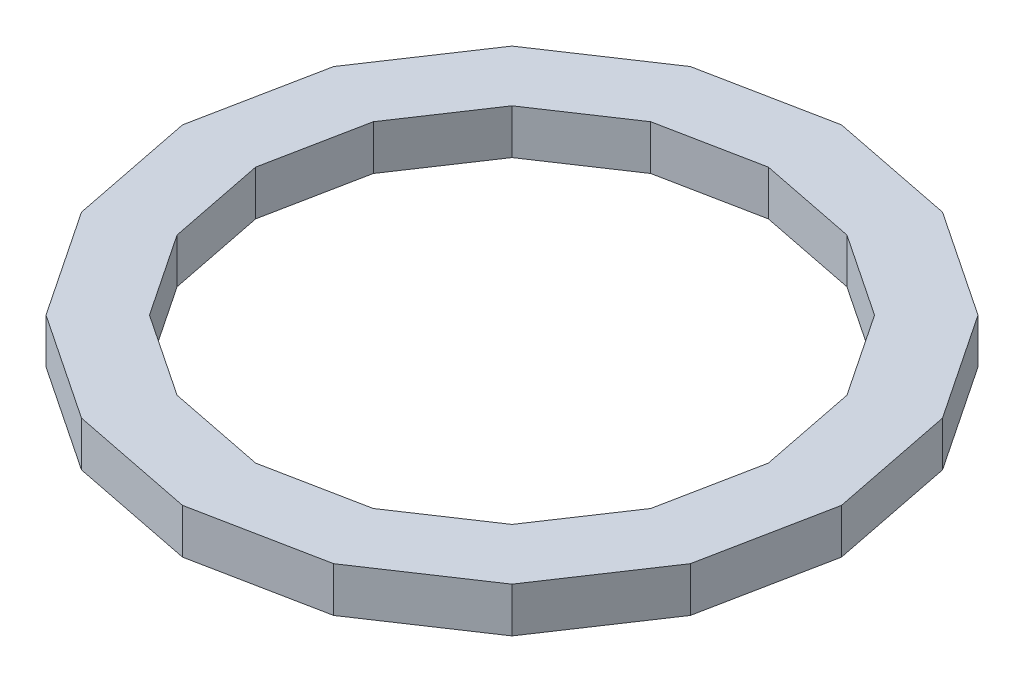
ISO-10303-21;
HEADER;
FILE_DESCRIPTION(('STEP AP214'),'2;1');
FILE_NAME('part.step','',(''),(''),'','','');
FILE_SCHEMA(('AUTOMOTIVE_DESIGN { 1 0 10303 214 1 1 1 1 }'));
ENDSEC;
DATA;
#1=APPLICATION_CONTEXT('core data for automotive mechanical design processes');
#2=APPLICATION_PROTOCOL_DEFINITION('international standard','automotive_design',2000,#1);
#3=PRODUCT_CONTEXT('',#1,'mechanical');
#4=PRODUCT('Part','Part','',(#3));
#5=PRODUCT_RELATED_PRODUCT_CATEGORY('part','',(#4));
#6=PRODUCT_DEFINITION_FORMATION('','',#4);
#7=PRODUCT_DEFINITION_CONTEXT('part definition',#1,'design');
#8=PRODUCT_DEFINITION('design','',#6,#7);
#9=PRODUCT_DEFINITION_SHAPE('','',#8);
#10=(LENGTH_UNIT() NAMED_UNIT(*) SI_UNIT(.MILLI.,.METRE.));
#11=(NAMED_UNIT(*) PLANE_ANGLE_UNIT() SI_UNIT($,.RADIAN.));
#12=(NAMED_UNIT(*) SI_UNIT($,.STERADIAN.) SOLID_ANGLE_UNIT());
#13=UNCERTAINTY_MEASURE_WITH_UNIT(LENGTH_MEASURE(1.E-05),#10,'distance_accuracy_value','');
#14=(GEOMETRIC_REPRESENTATION_CONTEXT(3) GLOBAL_UNCERTAINTY_ASSIGNED_CONTEXT((#13)) GLOBAL_UNIT_ASSIGNED_CONTEXT((#10,
#11,#12)) REPRESENTATION_CONTEXT('',''));
#15=CARTESIAN_POINT('',(0.,0.,0.));
#16=DIRECTION('',(0.,0.,1.));
#17=DIRECTION('',(1.,0.,0.));
#18=AXIS2_PLACEMENT_3D('',#15,#16,#17);
#19=CARTESIAN_POINT('',(0.,19.05,0.));
#20=DIRECTION('',(0.,1.,0.));
#21=DIRECTION('',(0.,0.,1.));
#22=AXIS2_PLACEMENT_3D('',#19,#20,#21);
#23=PLANE('',#22);
#24=DIRECTION('',(0.195090322016117,0.,-0.980785280403233));
#25=VECTOR('',#24,1.);
#26=CARTESIAN_POINT('',(129.306930115863,19.05,53.5606841628188));
#27=LINE('',#26,#25);
#28=CARTESIAN_POINT('',(129.306930115863,19.05,53.5606841628188));
#29=VERTEX_POINT('',#28);
#30=CARTESIAN_POINT('',(139.960812601163,19.05,-1.5126838018905E-12));
#31=VERTEX_POINT('',#30);
#32=EDGE_CURVE('E380',#29,#31,#27,.T.);
#33=ORIENTED_EDGE('',*,*,#32,.T.);
#34=DIRECTION('',(-0.19509032201614,0.,-0.980785280403228));
#35=VECTOR('',#34,1.);
#36=CARTESIAN_POINT('',(139.960812601163,19.05,-1.5126838018905E-12));
#37=LINE('',#36,#35);
#38=CARTESIAN_POINT('',(129.306930115862,19.05,-53.5606841628218));
#39=VERTEX_POINT('',#38);
#40=EDGE_CURVE('E384',#31,#39,#37,.T.);
#41=ORIENTED_EDGE('',*,*,#40,.T.);
#42=DIRECTION('',(-0.555570233019612,0.,-0.831469612302539));
#43=VECTOR('',#42,1.);
#44=CARTESIAN_POINT('',(129.306930115862,19.05,-53.5606841628218));
#45=LINE('',#44,#43);
#46=CARTESIAN_POINT('',(98.9672396906611,19.05,-98.9672396906633));
#47=VERTEX_POINT('',#46);
#48=EDGE_CURVE('E388',#39,#47,#45,.T.);
#49=ORIENTED_EDGE('',*,*,#48,.T.);
#50=DIRECTION('',(-0.831469612302552,0.,-0.555570233019593));
#51=VECTOR('',#50,1.);
#52=CARTESIAN_POINT('',(98.9672396906611,19.05,-98.9672396906633));
#53=LINE('',#52,#51);
#54=CARTESIAN_POINT('',(53.5606841628189,19.05,-129.306930115863));
#55=VERTEX_POINT('',#54);
#56=EDGE_CURVE('E391',#47,#55,#53,.T.);
#57=ORIENTED_EDGE('',*,*,#56,.T.);
#58=DIRECTION('',(-0.980785280403233,0.,-0.195090322016117));
#59=VECTOR('',#58,1.);
#60=CARTESIAN_POINT('',(53.5606841628189,19.05,-129.306930115863));
#61=LINE('',#60,#59);
#62=CARTESIAN_POINT('',(-1.65235058703493E-12,19.05,-139.960812601163));
#63=VERTEX_POINT('',#62);
#64=EDGE_CURVE('E393',#55,#63,#61,.T.);
#65=ORIENTED_EDGE('',*,*,#64,.T.);
#66=DIRECTION('',(-0.980785280403228,0.,0.19509032201614));
#67=VECTOR('',#66,1.);
#68=CARTESIAN_POINT('',(-1.65235058703493E-12,19.05,-139.960812601163));
#69=LINE('',#68,#67);
#70=CARTESIAN_POINT('',(-53.5606841628217,19.05,-129.306930115862));
#71=VERTEX_POINT('',#70);
#72=EDGE_CURVE('E395',#63,#71,#69,.T.);
#73=ORIENTED_EDGE('',*,*,#72,.T.);
#74=DIRECTION('',(-0.831469612302539,0.,0.555570233019612));
#75=VECTOR('',#74,1.);
#76=CARTESIAN_POINT('',(-53.5606841628217,19.05,-129.306930115862));
#77=LINE('',#76,#75);
#78=CARTESIAN_POINT('',(-98.9672396906633,19.05,-98.967239690661));
#79=VERTEX_POINT('',#78);
#80=EDGE_CURVE('E397',#71,#79,#77,.T.);
#81=ORIENTED_EDGE('',*,*,#80,.T.);
#82=DIRECTION('',(-0.555570233019592,0.,0.831469612302552));
#83=VECTOR('',#82,1.);
#84=CARTESIAN_POINT('',(-98.9672396906633,19.05,-98.967239690661));
#85=LINE('',#84,#83);
#86=CARTESIAN_POINT('',(-129.306930115863,19.05,-53.5606841628188));
#87=VERTEX_POINT('',#86);
#88=EDGE_CURVE('E399',#79,#87,#85,.T.);
#89=ORIENTED_EDGE('',*,*,#88,.T.);
#90=DIRECTION('',(-0.195090322016117,0.,0.980785280403233));
#91=VECTOR('',#90,1.);
#92=CARTESIAN_POINT('',(-129.306930115863,19.05,-53.5606841628188));
#93=LINE('',#92,#91);
#94=CARTESIAN_POINT('',(-139.960812601163,19.05,1.62968860943787E-12));
#95=VERTEX_POINT('',#94);
#96=EDGE_CURVE('E401',#87,#95,#93,.T.);
#97=ORIENTED_EDGE('',*,*,#96,.T.);
#98=DIRECTION('',(0.195090322016139,0.,0.980785280403228));
#99=VECTOR('',#98,1.);
#100=CARTESIAN_POINT('',(-139.960812601163,19.05,1.62968860943787E-12));
#101=LINE('',#100,#99);
#102=CARTESIAN_POINT('',(-129.306930115862,19.05,53.5606841628218));
#103=VERTEX_POINT('',#102);
#104=EDGE_CURVE('E403',#95,#103,#101,.T.);
#105=ORIENTED_EDGE('',*,*,#104,.T.);
#106=DIRECTION('',(0.555570233019612,0.,0.831469612302539));
#107=VECTOR('',#106,1.);
#108=CARTESIAN_POINT('',(-129.306930115862,19.05,53.5606841628218));
#109=LINE('',#108,#107);
#110=CARTESIAN_POINT('',(-98.967239690661,19.05,98.9672396906634));
#111=VERTEX_POINT('',#110);
#112=EDGE_CURVE('E406',#103,#111,#109,.T.);
#113=ORIENTED_EDGE('',*,*,#112,.T.);
#114=DIRECTION('',(0.831469612302552,0.,0.555570233019593));
#115=VECTOR('',#114,1.);
#116=CARTESIAN_POINT('',(-98.967239690661,19.05,98.9672396906634));
#117=LINE('',#116,#115);
#118=CARTESIAN_POINT('',(-53.5606841628188,19.05,129.306930115863));
#119=VERTEX_POINT('',#118);
#120=EDGE_CURVE('E409',#111,#119,#117,.T.);
#121=ORIENTED_EDGE('',*,*,#120,.T.);
#122=DIRECTION('',(0.980785280403233,0.,0.195090322016117));
#123=VECTOR('',#122,1.);
#124=CARTESIAN_POINT('',(-53.5606841628188,19.05,129.306930115863));
#125=LINE('',#124,#123);
#126=CARTESIAN_POINT('',(1.57875692117621E-12,19.05,139.960812601163));
#127=VERTEX_POINT('',#126);
#128=EDGE_CURVE('E411',#119,#127,#125,.T.);
#129=ORIENTED_EDGE('',*,*,#128,.T.);
#130=DIRECTION('',(0.980785280403228,0.,-0.195090322016139));
#131=VECTOR('',#130,1.);
#132=CARTESIAN_POINT('',(1.57875692117621E-12,19.05,139.960812601163));
#133=LINE('',#132,#131);
#134=CARTESIAN_POINT('',(53.5606841628218,19.05,129.306930115862));
#135=VERTEX_POINT('',#134);
#136=EDGE_CURVE('E413',#127,#135,#133,.T.);
#137=ORIENTED_EDGE('',*,*,#136,.T.);
#138=DIRECTION('',(0.831469612302539,0.,-0.555570233019612));
#139=VECTOR('',#138,1.);
#140=CARTESIAN_POINT('',(53.5606841628218,19.05,129.306930115862));
#141=LINE('',#140,#139);
#142=CARTESIAN_POINT('',(98.9672396906634,19.05,98.967239690661));
#143=VERTEX_POINT('',#142);
#144=EDGE_CURVE('E415',#135,#143,#141,.T.);
#145=ORIENTED_EDGE('',*,*,#144,.T.);
#146=DIRECTION('',(0.555570233019593,0.,-0.831469612302552));
#147=VECTOR('',#146,1.);
#148=CARTESIAN_POINT('',(98.9672396906634,19.05,98.967239690661));
#149=LINE('',#148,#147);
#150=EDGE_CURVE('E417',#143,#29,#149,.T.);
#151=ORIENTED_EDGE('',*,*,#150,.T.);
#152=EDGE_LOOP('',(#33,#41,#49,#57,#65,#73,#81,#89,#97,#105,#113,#121,#129,#137,#145,#151));
#153=FACE_BOUND('',#152,.T.);
#154=DIRECTION('',(-0.19509032201614,0.,-0.980785280403228));
#155=VECTOR('',#154,1.);
#156=CARTESIAN_POINT('',(108.883674098974,19.05,-1.24629656804779E-12));
#157=LINE('',#156,#155);
#158=CARTESIAN_POINT('',(108.883674098974,19.05,-1.24629656804779E-12));
#159=VERTEX_POINT('',#158);
#160=CARTESIAN_POINT('',(100.595397924671,19.05,-41.6679781327183));
#161=VERTEX_POINT('',#160);
#162=EDGE_CURVE('E253',#159,#161,#157,.T.);
#163=ORIENTED_EDGE('',*,*,#162,.F.);
#164=DIRECTION('',(0.195090322016117,0.,-0.980785280403233));
#165=VECTOR('',#164,1.);
#166=CARTESIAN_POINT('',(100.595397924672,19.05,41.6679781327159));
#167=LINE('',#166,#165);
#168=CARTESIAN_POINT('',(100.595397924672,19.05,41.6679781327159));
#169=VERTEX_POINT('',#168);
#170=EDGE_CURVE('E244',#169,#159,#167,.T.);
#171=ORIENTED_EDGE('',*,*,#170,.F.);
#172=DIRECTION('',(0.555570233019592,0.,-0.831469612302552));
#173=VECTOR('',#172,1.);
#174=CARTESIAN_POINT('',(76.9923843158913,19.05,76.9923843158895));
#175=LINE('',#174,#173);
#176=CARTESIAN_POINT('',(76.9923843158914,19.05,76.9923843158895));
#177=VERTEX_POINT('',#176);
#178=EDGE_CURVE('E303',#177,#169,#175,.T.);
#179=ORIENTED_EDGE('',*,*,#178,.F.);
#180=DIRECTION('',(0.831469612302539,0.,-0.555570233019612));
#181=VECTOR('',#180,1.);
#182=CARTESIAN_POINT('',(41.6679781327183,19.05,100.595397924671));
#183=LINE('',#182,#181);
#184=CARTESIAN_POINT('',(41.6679781327183,19.05,100.595397924671));
#185=VERTEX_POINT('',#184);
#186=EDGE_CURVE('E301',#185,#177,#183,.T.);
#187=ORIENTED_EDGE('',*,*,#186,.F.);
#188=DIRECTION('',(0.980785280403228,0.,-0.19509032201614));
#189=VECTOR('',#188,1.);
#190=CARTESIAN_POINT('',(1.29222973637754E-12,19.05,108.883674098974));
#191=LINE('',#190,#189);
#192=CARTESIAN_POINT('',(1.29222973637754E-12,19.05,108.883674098974));
#193=VERTEX_POINT('',#192);
#194=EDGE_CURVE('E299',#193,#185,#191,.T.);
#195=ORIENTED_EDGE('',*,*,#194,.F.);
#196=DIRECTION('',(0.980785280403233,0.,0.195090322016117));
#197=VECTOR('',#196,1.);
#198=CARTESIAN_POINT('',(-41.667978132716,19.05,100.595397924672));
#199=LINE('',#198,#197);
#200=CARTESIAN_POINT('',(-41.667978132716,19.05,100.595397924672));
#201=VERTEX_POINT('',#200);
#202=EDGE_CURVE('E297',#201,#193,#199,.T.);
#203=ORIENTED_EDGE('',*,*,#202,.F.);
#204=DIRECTION('',(0.831469612302552,0.,0.555570233019592));
#205=VECTOR('',#204,1.);
#206=CARTESIAN_POINT('',(-76.9923843158895,19.05,76.9923843158913));
#207=LINE('',#206,#205);
#208=CARTESIAN_POINT('',(-76.9923843158895,19.05,76.9923843158913));
#209=VERTEX_POINT('',#208);
#210=EDGE_CURVE('E295',#209,#201,#207,.T.);
#211=ORIENTED_EDGE('',*,*,#210,.F.);
#212=DIRECTION('',(0.555570233019612,0.,0.831469612302539));
#213=VECTOR('',#212,1.);
#214=CARTESIAN_POINT('',(-100.595397924671,19.05,41.6679781327183));
#215=LINE('',#214,#213);
#216=CARTESIAN_POINT('',(-100.595397924671,19.05,41.6679781327183));
#217=VERTEX_POINT('',#216);
#218=EDGE_CURVE('E292',#217,#209,#215,.T.);
#219=ORIENTED_EDGE('',*,*,#218,.F.);
#220=DIRECTION('',(0.19509032201614,0.,0.980785280403228));
#221=VECTOR('',#220,1.);
#222=CARTESIAN_POINT('',(-108.883674098974,19.05,1.25882273636481E-12));
#223=LINE('',#222,#221);
#224=CARTESIAN_POINT('',(-108.883674098974,19.05,1.25882273636481E-12));
#225=VERTEX_POINT('',#224);
#226=EDGE_CURVE('E290',#225,#217,#223,.T.);
#227=ORIENTED_EDGE('',*,*,#226,.F.);
#228=DIRECTION('',(-0.195090322016117,0.,0.980785280403233));
#229=VECTOR('',#228,1.);
#230=CARTESIAN_POINT('',(-100.595397924672,19.05,-41.6679781327159));
#231=LINE('',#230,#229);
#232=CARTESIAN_POINT('',(-100.595397924672,19.05,-41.6679781327159));
#233=VERTEX_POINT('',#232);
#234=EDGE_CURVE('E287',#233,#225,#231,.T.);
#235=ORIENTED_EDGE('',*,*,#234,.F.);
#236=DIRECTION('',(-0.555570233019592,0.,0.831469612302552));
#237=VECTOR('',#236,1.);
#238=CARTESIAN_POINT('',(-76.9923843158914,19.05,-76.9923843158895));
#239=LINE('',#238,#237);
#240=CARTESIAN_POINT('',(-76.9923843158914,19.05,-76.9923843158895));
#241=VERTEX_POINT('',#240);
#242=EDGE_CURVE('E285',#241,#233,#239,.T.);
#243=ORIENTED_EDGE('',*,*,#242,.F.);
#244=DIRECTION('',(-0.831469612302539,0.,0.555570233019612));
#245=VECTOR('',#244,1.);
#246=CARTESIAN_POINT('',(-41.6679781327183,19.05,-100.595397924671));
#247=LINE('',#246,#245);
#248=CARTESIAN_POINT('',(-41.6679781327183,19.05,-100.595397924671));
#249=VERTEX_POINT('',#248);
#250=EDGE_CURVE('E282',#249,#241,#247,.T.);
#251=ORIENTED_EDGE('',*,*,#250,.F.);
#252=DIRECTION('',(-0.980785280403228,0.,0.19509032201614));
#253=VECTOR('',#252,1.);
#254=CARTESIAN_POINT('',(-1.30898814574068E-12,19.05,-108.883674098974));
#255=LINE('',#254,#253);
#256=CARTESIAN_POINT('',(-1.30898814574068E-12,19.05,-108.883674098974));
#257=VERTEX_POINT('',#256);
#258=EDGE_CURVE('E280',#257,#249,#255,.T.);
#259=ORIENTED_EDGE('',*,*,#258,.F.);
#260=DIRECTION('',(-0.980785280403233,0.,-0.195090322016116));
#261=VECTOR('',#260,1.);
#262=CARTESIAN_POINT('',(41.6679781327161,19.05,-100.595397924672));
#263=LINE('',#262,#261);
#264=CARTESIAN_POINT('',(41.6679781327161,19.05,-100.595397924672));
#265=VERTEX_POINT('',#264);
#266=EDGE_CURVE('E278',#265,#257,#263,.T.);
#267=ORIENTED_EDGE('',*,*,#266,.F.);
#268=DIRECTION('',(-0.831469612302552,0.,-0.555570233019593));
#269=VECTOR('',#268,1.);
#270=CARTESIAN_POINT('',(76.9923843158895,19.05,-76.9923843158914));
#271=LINE('',#270,#269);
#272=CARTESIAN_POINT('',(76.9923843158895,19.05,-76.9923843158914));
#273=VERTEX_POINT('',#272);
#274=EDGE_CURVE('E273',#273,#265,#271,.T.);
#275=ORIENTED_EDGE('',*,*,#274,.F.);
#276=DIRECTION('',(-0.555570233019612,0.,-0.831469612302538));
#277=VECTOR('',#276,1.);
#278=CARTESIAN_POINT('',(100.595397924671,19.05,-41.6679781327183));
#279=LINE('',#278,#277);
#280=EDGE_CURVE('E266',#161,#273,#279,.T.);
#281=ORIENTED_EDGE('',*,*,#280,.F.);
#282=EDGE_LOOP('',(#163,#171,#179,#187,#195,#203,#211,#219,#227,#235,#243,#251,#259,#267,#275,#281));
#283=FACE_BOUND('',#282,.T.);
#284=ADVANCED_FACE('F35',(#153,#283),#23,.T.);
#285=CARTESIAN_POINT('',(0.,0.,0.));
#286=DIRECTION('',(0.,1.,0.));
#287=DIRECTION('',(0.,0.,1.));
#288=AXIS2_PLACEMENT_3D('',#285,#286,#287);
#289=PLANE('',#288);
#290=DIRECTION('',(0.195090322016117,0.,-0.980785280403233));
#291=VECTOR('',#290,1.);
#292=CARTESIAN_POINT('',(129.306930115863,0.,53.5606841628188));
#293=LINE('',#292,#291);
#294=CARTESIAN_POINT('',(129.306930115863,0.,53.5606841628188));
#295=VERTEX_POINT('',#294);
#296=CARTESIAN_POINT('',(139.960812601163,0.,-1.5126838018905E-12));
#297=VERTEX_POINT('',#296);
#298=EDGE_CURVE('E261',#295,#297,#293,.T.);
#299=ORIENTED_EDGE('',*,*,#298,.F.);
#300=DIRECTION('',(0.555570233019593,0.,-0.831469612302552));
#301=VECTOR('',#300,1.);
#302=CARTESIAN_POINT('',(98.9672396906634,0.,98.967239690661));
#303=LINE('',#302,#301);
#304=CARTESIAN_POINT('',(98.9672396906634,0.,98.967239690661));
#305=VERTEX_POINT('',#304);
#306=EDGE_CURVE('E385',#305,#295,#303,.T.);
#307=ORIENTED_EDGE('',*,*,#306,.F.);
#308=DIRECTION('',(0.831469612302539,0.,-0.555570233019612));
#309=VECTOR('',#308,1.);
#310=CARTESIAN_POINT('',(53.5606841628218,0.,129.306930115862));
#311=LINE('',#310,#309);
#312=CARTESIAN_POINT('',(53.5606841628218,0.,129.306930115862));
#313=VERTEX_POINT('',#312);
#314=EDGE_CURVE('E451',#313,#305,#311,.T.);
#315=ORIENTED_EDGE('',*,*,#314,.F.);
#316=DIRECTION('',(0.980785280403228,0.,-0.195090322016139));
#317=VECTOR('',#316,1.);
#318=CARTESIAN_POINT('',(1.57875692117621E-12,0.,139.960812601163));
#319=LINE('',#318,#317);
#320=CARTESIAN_POINT('',(1.57875692117621E-12,0.,139.960812601163));
#321=VERTEX_POINT('',#320);
#322=EDGE_CURVE('E449',#321,#313,#319,.T.);
#323=ORIENTED_EDGE('',*,*,#322,.F.);
#324=DIRECTION('',(0.980785280403233,0.,0.195090322016117));
#325=VECTOR('',#324,1.);
#326=CARTESIAN_POINT('',(-53.5606841628188,0.,129.306930115863));
#327=LINE('',#326,#325);
#328=CARTESIAN_POINT('',(-53.5606841628188,0.,129.306930115863));
#329=VERTEX_POINT('',#328);
#330=EDGE_CURVE('E446',#329,#321,#327,.T.);
#331=ORIENTED_EDGE('',*,*,#330,.F.);
#332=DIRECTION('',(0.831469612302552,0.,0.555570233019593));
#333=VECTOR('',#332,1.);
#334=CARTESIAN_POINT('',(-98.967239690661,0.,98.9672396906634));
#335=LINE('',#334,#333);
#336=CARTESIAN_POINT('',(-98.967239690661,0.,98.9672396906634));
#337=VERTEX_POINT('',#336);
#338=EDGE_CURVE('E444',#337,#329,#335,.T.);
#339=ORIENTED_EDGE('',*,*,#338,.F.);
#340=DIRECTION('',(0.555570233019612,0.,0.831469612302539));
#341=VECTOR('',#340,1.);
#342=CARTESIAN_POINT('',(-129.306930115862,0.,53.5606841628218));
#343=LINE('',#342,#341);
#344=CARTESIAN_POINT('',(-129.306930115862,0.,53.5606841628218));
#345=VERTEX_POINT('',#344);
#346=EDGE_CURVE('E442',#345,#337,#343,.T.);
#347=ORIENTED_EDGE('',*,*,#346,.F.);
#348=DIRECTION('',(0.195090322016139,0.,0.980785280403228));
#349=VECTOR('',#348,1.);
#350=CARTESIAN_POINT('',(-139.960812601163,0.,1.62968860943787E-12));
#351=LINE('',#350,#349);
#352=CARTESIAN_POINT('',(-139.960812601163,0.,1.62968860943787E-12));
#353=VERTEX_POINT('',#352);
#354=EDGE_CURVE('E440',#353,#345,#351,.T.);
#355=ORIENTED_EDGE('',*,*,#354,.F.);
#356=DIRECTION('',(-0.195090322016117,0.,0.980785280403233));
#357=VECTOR('',#356,1.);
#358=CARTESIAN_POINT('',(-129.306930115863,0.,-53.5606841628188));
#359=LINE('',#358,#357);
#360=CARTESIAN_POINT('',(-129.306930115863,0.,-53.5606841628188));
#361=VERTEX_POINT('',#360);
#362=EDGE_CURVE('E438',#361,#353,#359,.T.);
#363=ORIENTED_EDGE('',*,*,#362,.F.);
#364=DIRECTION('',(-0.555570233019592,0.,0.831469612302552));
#365=VECTOR('',#364,1.);
#366=CARTESIAN_POINT('',(-98.9672396906633,0.,-98.967239690661));
#367=LINE('',#366,#365);
#368=CARTESIAN_POINT('',(-98.9672396906633,0.,-98.967239690661));
#369=VERTEX_POINT('',#368);
#370=EDGE_CURVE('E436',#369,#361,#367,.T.);
#371=ORIENTED_EDGE('',*,*,#370,.F.);
#372=DIRECTION('',(-0.831469612302539,0.,0.555570233019612));
#373=VECTOR('',#372,1.);
#374=CARTESIAN_POINT('',(-53.5606841628217,0.,-129.306930115862));
#375=LINE('',#374,#373);
#376=CARTESIAN_POINT('',(-53.5606841628217,0.,-129.306930115862));
#377=VERTEX_POINT('',#376);
#378=EDGE_CURVE('E434',#377,#369,#375,.T.);
#379=ORIENTED_EDGE('',*,*,#378,.F.);
#380=DIRECTION('',(-0.980785280403228,0.,0.19509032201614));
#381=VECTOR('',#380,1.);
#382=CARTESIAN_POINT('',(-1.65235058703493E-12,0.,-139.960812601163));
#383=LINE('',#382,#381);
#384=CARTESIAN_POINT('',(-1.65235058703493E-12,0.,-139.960812601163));
#385=VERTEX_POINT('',#384);
#386=EDGE_CURVE('E432',#385,#377,#383,.T.);
#387=ORIENTED_EDGE('',*,*,#386,.F.);
#388=DIRECTION('',(-0.980785280403233,0.,-0.195090322016117));
#389=VECTOR('',#388,1.);
#390=CARTESIAN_POINT('',(53.5606841628189,0.,-129.306930115863));
#391=LINE('',#390,#389);
#392=CARTESIAN_POINT('',(53.5606841628189,0.,-129.306930115863));
#393=VERTEX_POINT('',#392);
#394=EDGE_CURVE('E430',#393,#385,#391,.T.);
#395=ORIENTED_EDGE('',*,*,#394,.F.);
#396=DIRECTION('',(-0.831469612302552,0.,-0.555570233019593));
#397=VECTOR('',#396,1.);
#398=CARTESIAN_POINT('',(98.9672396906611,0.,-98.9672396906633));
#399=LINE('',#398,#397);
#400=CARTESIAN_POINT('',(98.9672396906611,0.,-98.9672396906633));
#401=VERTEX_POINT('',#400);
#402=EDGE_CURVE('E428',#401,#393,#399,.T.);
#403=ORIENTED_EDGE('',*,*,#402,.F.);
#404=DIRECTION('',(-0.555570233019612,0.,-0.831469612302539));
#405=VECTOR('',#404,1.);
#406=CARTESIAN_POINT('',(129.306930115862,0.,-53.5606841628218));
#407=LINE('',#406,#405);
#408=CARTESIAN_POINT('',(129.306930115862,0.,-53.5606841628218));
#409=VERTEX_POINT('',#408);
#410=EDGE_CURVE('E425',#409,#401,#407,.T.);
#411=ORIENTED_EDGE('',*,*,#410,.F.);
#412=DIRECTION('',(-0.19509032201614,0.,-0.980785280403228));
#413=VECTOR('',#412,1.);
#414=CARTESIAN_POINT('',(139.960812601163,0.,-1.5126838018905E-12));
#415=LINE('',#414,#413);
#416=EDGE_CURVE('E422',#297,#409,#415,.T.);
#417=ORIENTED_EDGE('',*,*,#416,.F.);
#418=EDGE_LOOP('',(#299,#307,#315,#323,#331,#339,#347,#355,#363,#371,#379,#387,#395,#403,#411,#417));
#419=FACE_BOUND('',#418,.T.);
#420=DIRECTION('',(0.195090322016117,0.,-0.980785280403233));
#421=VECTOR('',#420,1.);
#422=CARTESIAN_POINT('',(100.595397924672,0.,41.6679781327159));
#423=LINE('',#422,#421);
#424=CARTESIAN_POINT('',(100.595397924672,0.,41.6679781327159));
#425=VERTEX_POINT('',#424);
#426=CARTESIAN_POINT('',(108.883674098974,0.,-1.24629656804779E-12));
#427=VERTEX_POINT('',#426);
#428=EDGE_CURVE('E58',#425,#427,#423,.T.);
#429=ORIENTED_EDGE('',*,*,#428,.T.);
#430=DIRECTION('',(-0.19509032201614,0.,-0.980785280403228));
#431=VECTOR('',#430,1.);
#432=CARTESIAN_POINT('',(108.883674098974,0.,-1.24629656804779E-12));
#433=LINE('',#432,#431);
#434=CARTESIAN_POINT('',(100.595397924671,0.,-41.6679781327183));
#435=VERTEX_POINT('',#434);
#436=EDGE_CURVE('E260',#427,#435,#433,.T.);
#437=ORIENTED_EDGE('',*,*,#436,.T.);
#438=DIRECTION('',(-0.555570233019612,0.,-0.831469612302538));
#439=VECTOR('',#438,1.);
#440=CARTESIAN_POINT('',(100.595397924671,0.,-41.6679781327183));
#441=LINE('',#440,#439);
#442=CARTESIAN_POINT('',(76.9923843158895,0.,-76.9923843158914));
#443=VERTEX_POINT('',#442);
#444=EDGE_CURVE('E309',#435,#443,#441,.T.);
#445=ORIENTED_EDGE('',*,*,#444,.T.);
#446=DIRECTION('',(-0.831469612302552,0.,-0.555570233019593));
#447=VECTOR('',#446,1.);
#448=CARTESIAN_POINT('',(76.9923843158895,0.,-76.9923843158914));
#449=LINE('',#448,#447);
#450=CARTESIAN_POINT('',(41.6679781327161,0.,-100.595397924672));
#451=VERTEX_POINT('',#450);
#452=EDGE_CURVE('E312',#443,#451,#449,.T.);
#453=ORIENTED_EDGE('',*,*,#452,.T.);
#454=DIRECTION('',(-0.980785280403233,0.,-0.195090322016116));
#455=VECTOR('',#454,1.);
#456=CARTESIAN_POINT('',(41.6679781327161,0.,-100.595397924672));
#457=LINE('',#456,#455);
#458=CARTESIAN_POINT('',(-1.30898814574068E-12,0.,-108.883674098974));
#459=VERTEX_POINT('',#458);
#460=EDGE_CURVE('E315',#451,#459,#457,.T.);
#461=ORIENTED_EDGE('',*,*,#460,.T.);
#462=DIRECTION('',(-0.980785280403228,0.,0.19509032201614));
#463=VECTOR('',#462,1.);
#464=CARTESIAN_POINT('',(-1.30898814574068E-12,0.,-108.883674098974));
#465=LINE('',#464,#463);
#466=CARTESIAN_POINT('',(-41.6679781327183,0.,-100.595397924671));
#467=VERTEX_POINT('',#466);
#468=EDGE_CURVE('E319',#459,#467,#465,.T.);
#469=ORIENTED_EDGE('',*,*,#468,.T.);
#470=DIRECTION('',(-0.831469612302539,0.,0.555570233019612));
#471=VECTOR('',#470,1.);
#472=CARTESIAN_POINT('',(-41.6679781327183,0.,-100.595397924671));
#473=LINE('',#472,#471);
#474=CARTESIAN_POINT('',(-76.9923843158914,0.,-76.9923843158895));
#475=VERTEX_POINT('',#474);
#476=EDGE_CURVE('E323',#467,#475,#473,.T.);
#477=ORIENTED_EDGE('',*,*,#476,.T.);
#478=DIRECTION('',(-0.555570233019592,0.,0.831469612302552));
#479=VECTOR('',#478,1.);
#480=CARTESIAN_POINT('',(-76.9923843158914,0.,-76.9923843158895));
#481=LINE('',#480,#479);
#482=CARTESIAN_POINT('',(-100.595397924672,0.,-41.6679781327159));
#483=VERTEX_POINT('',#482);
#484=EDGE_CURVE('E327',#475,#483,#481,.T.);
#485=ORIENTED_EDGE('',*,*,#484,.T.);
#486=DIRECTION('',(-0.195090322016117,0.,0.980785280403233));
#487=VECTOR('',#486,1.);
#488=CARTESIAN_POINT('',(-100.595397924672,0.,-41.6679781327159));
#489=LINE('',#488,#487);
#490=CARTESIAN_POINT('',(-108.883674098974,0.,1.25882273636481E-12));
#491=VERTEX_POINT('',#490);
#492=EDGE_CURVE('E330',#483,#491,#489,.T.);
#493=ORIENTED_EDGE('',*,*,#492,.T.);
#494=DIRECTION('',(0.19509032201614,0.,0.980785280403228));
#495=VECTOR('',#494,1.);
#496=CARTESIAN_POINT('',(-108.883674098974,0.,1.25882273636481E-12));
#497=LINE('',#496,#495);
#498=CARTESIAN_POINT('',(-100.595397924671,0.,41.6679781327183));
#499=VERTEX_POINT('',#498);
#500=EDGE_CURVE('E333',#491,#499,#497,.T.);
#501=ORIENTED_EDGE('',*,*,#500,.T.);
#502=DIRECTION('',(0.555570233019612,0.,0.831469612302539));
#503=VECTOR('',#502,1.);
#504=CARTESIAN_POINT('',(-100.595397924671,0.,41.6679781327183));
#505=LINE('',#504,#503);
#506=CARTESIAN_POINT('',(-76.9923843158895,0.,76.9923843158913));
#507=VERTEX_POINT('',#506);
#508=EDGE_CURVE('E336',#499,#507,#505,.T.);
#509=ORIENTED_EDGE('',*,*,#508,.T.);
#510=DIRECTION('',(0.831469612302552,0.,0.555570233019592));
#511=VECTOR('',#510,1.);
#512=CARTESIAN_POINT('',(-76.9923843158895,0.,76.9923843158913));
#513=LINE('',#512,#511);
#514=CARTESIAN_POINT('',(-41.667978132716,0.,100.595397924672));
#515=VERTEX_POINT('',#514);
#516=EDGE_CURVE('E339',#507,#515,#513,.T.);
#517=ORIENTED_EDGE('',*,*,#516,.T.);
#518=DIRECTION('',(0.980785280403233,0.,0.195090322016117));
#519=VECTOR('',#518,1.);
#520=CARTESIAN_POINT('',(-41.667978132716,0.,100.595397924672));
#521=LINE('',#520,#519);
#522=CARTESIAN_POINT('',(1.29222973637754E-12,0.,108.883674098974));
#523=VERTEX_POINT('',#522);
#524=EDGE_CURVE('E342',#515,#523,#521,.T.);
#525=ORIENTED_EDGE('',*,*,#524,.T.);
#526=DIRECTION('',(0.980785280403228,0.,-0.19509032201614));
#527=VECTOR('',#526,1.);
#528=CARTESIAN_POINT('',(1.29222973637754E-12,0.,108.883674098974));
#529=LINE('',#528,#527);
#530=CARTESIAN_POINT('',(41.6679781327183,0.,100.595397924671));
#531=VERTEX_POINT('',#530);
#532=EDGE_CURVE('E345',#523,#531,#529,.T.);
#533=ORIENTED_EDGE('',*,*,#532,.T.);
#534=DIRECTION('',(0.831469612302539,0.,-0.555570233019612));
#535=VECTOR('',#534,1.);
#536=CARTESIAN_POINT('',(41.6679781327183,0.,100.595397924671));
#537=LINE('',#536,#535);
#538=CARTESIAN_POINT('',(76.9923843158913,0.,76.9923843158895));
#539=VERTEX_POINT('',#538);
#540=EDGE_CURVE('E348',#531,#539,#537,.T.);
#541=ORIENTED_EDGE('',*,*,#540,.T.);
#542=DIRECTION('',(0.555570233019592,0.,-0.831469612302552));
#543=VECTOR('',#542,1.);
#544=CARTESIAN_POINT('',(76.9923843158913,0.,76.9923843158895));
#545=LINE('',#544,#543);
#546=EDGE_CURVE('E254',#539,#425,#545,.T.);
#547=ORIENTED_EDGE('',*,*,#546,.T.);
#548=EDGE_LOOP('',(#429,#437,#445,#453,#461,#469,#477,#485,#493,#501,#509,#517,#525,#533,#541,#547));
#549=FACE_BOUND('',#548,.T.);
#550=ADVANCED_FACE('F511',(#419,#549),#289,.F.);
#551=CARTESIAN_POINT('',(129.306930115863,19.05,53.5606841628188));
#552=DIRECTION('',(-0.980785280403233,0.,-0.195090322016117));
#553=DIRECTION('',(-0.195090322016117,0.,0.980785280403233));
#554=AXIS2_PLACEMENT_3D('',#551,#552,#553);
#555=PLANE('',#554);
#556=ORIENTED_EDGE('',*,*,#298,.T.);
#557=DIRECTION('',(0.,-1.,0.));
#558=VECTOR('',#557,1.);
#559=CARTESIAN_POINT('',(139.960812601163,19.05,-1.5126838018905E-12));
#560=LINE('',#559,#558);
#561=EDGE_CURVE('E11',#31,#297,#560,.T.);
#562=ORIENTED_EDGE('',*,*,#561,.F.);
#563=ORIENTED_EDGE('',*,*,#32,.F.);
#564=DIRECTION('',(0.,-1.,0.));
#565=VECTOR('',#564,1.);
#566=CARTESIAN_POINT('',(129.306930115863,19.05,53.5606841628188));
#567=LINE('',#566,#565);
#568=EDGE_CURVE('E419',#29,#295,#567,.T.);
#569=ORIENTED_EDGE('',*,*,#568,.T.);
#570=EDGE_LOOP('',(#556,#562,#563,#569));
#571=FACE_BOUND('',#570,.T.);
#572=ADVANCED_FACE('F37',(#571),#555,.F.);
#573=CARTESIAN_POINT('',(139.960812601163,19.05,-1.5126838018905E-12));
#574=DIRECTION('',(-0.980785280403228,0.,0.19509032201614));
#575=DIRECTION('',(0.19509032201614,0.,0.980785280403228));
#576=AXIS2_PLACEMENT_3D('',#573,#574,#575);
#577=PLANE('',#576);
#578=ORIENTED_EDGE('',*,*,#416,.T.);
#579=DIRECTION('',(0.,-1.,0.));
#580=VECTOR('',#579,1.);
#581=CARTESIAN_POINT('',(129.306930115862,19.05,-53.5606841628218));
#582=LINE('',#581,#580);
#583=EDGE_CURVE('E43',#39,#409,#582,.T.);
#584=ORIENTED_EDGE('',*,*,#583,.F.);
#585=ORIENTED_EDGE('',*,*,#40,.F.);
#586=ORIENTED_EDGE('',*,*,#561,.T.);
#587=EDGE_LOOP('',(#578,#584,#585,#586));
#588=FACE_BOUND('',#587,.T.);
#589=ADVANCED_FACE('F528',(#588),#577,.F.);
#590=CARTESIAN_POINT('',(129.306930115862,19.05,-53.5606841628218));
#591=DIRECTION('',(-0.831469612302539,0.,0.555570233019612));
#592=DIRECTION('',(0.555570233019612,0.,0.831469612302539));
#593=AXIS2_PLACEMENT_3D('',#590,#591,#592);
#594=PLANE('',#593);
#595=ORIENTED_EDGE('',*,*,#410,.T.);
#596=DIRECTION('',(0.,-1.,0.));
#597=VECTOR('',#596,1.);
#598=CARTESIAN_POINT('',(98.9672396906611,19.05,-98.9672396906633));
#599=LINE('',#598,#597);
#600=EDGE_CURVE('E496',#47,#401,#599,.T.);
#601=ORIENTED_EDGE('',*,*,#600,.F.);
#602=ORIENTED_EDGE('',*,*,#48,.F.);
#603=ORIENTED_EDGE('',*,*,#583,.T.);
#604=EDGE_LOOP('',(#595,#601,#602,#603));
#605=FACE_BOUND('',#604,.T.);
#606=ADVANCED_FACE('F505',(#605),#594,.F.);
#607=CARTESIAN_POINT('',(98.9672396906611,19.05,-98.9672396906633));
#608=DIRECTION('',(-0.555570233019592,0.,0.831469612302552));
#609=DIRECTION('',(0.831469612302552,0.,0.555570233019593));
#610=AXIS2_PLACEMENT_3D('',#607,#608,#609);
#611=PLANE('',#610);
#612=ORIENTED_EDGE('',*,*,#402,.T.);
#613=DIRECTION('',(0.,-1.,0.));
#614=VECTOR('',#613,1.);
#615=CARTESIAN_POINT('',(53.5606841628189,19.05,-129.306930115863));
#616=LINE('',#615,#614);
#617=EDGE_CURVE('E493',#55,#393,#616,.T.);
#618=ORIENTED_EDGE('',*,*,#617,.F.);
#619=ORIENTED_EDGE('',*,*,#56,.F.);
#620=ORIENTED_EDGE('',*,*,#600,.T.);
#621=EDGE_LOOP('',(#612,#618,#619,#620));
#622=FACE_BOUND('',#621,.T.);
#623=ADVANCED_FACE('F517',(#622),#611,.F.);
#624=CARTESIAN_POINT('',(53.5606841628189,19.05,-129.306930115863));
#625=DIRECTION('',(-0.195090322016117,0.,0.980785280403233));
#626=DIRECTION('',(0.980785280403233,0.,0.195090322016117));
#627=AXIS2_PLACEMENT_3D('',#624,#625,#626);
#628=PLANE('',#627);
#629=ORIENTED_EDGE('',*,*,#394,.T.);
#630=DIRECTION('',(0.,-1.,0.));
#631=VECTOR('',#630,1.);
#632=CARTESIAN_POINT('',(-1.65235058703493E-12,19.05,-139.960812601163));
#633=LINE('',#632,#631);
#634=EDGE_CURVE('E490',#63,#385,#633,.T.);
#635=ORIENTED_EDGE('',*,*,#634,.F.);
#636=ORIENTED_EDGE('',*,*,#64,.F.);
#637=ORIENTED_EDGE('',*,*,#617,.T.);
#638=EDGE_LOOP('',(#629,#635,#636,#637));
#639=FACE_BOUND('',#638,.T.);
#640=ADVANCED_FACE('F521',(#639),#628,.F.);
#641=CARTESIAN_POINT('',(-1.65235058703493E-12,19.05,-139.960812601163));
#642=DIRECTION('',(0.19509032201614,0.,0.980785280403228));
#643=DIRECTION('',(0.980785280403228,0.,-0.19509032201614));
#644=AXIS2_PLACEMENT_3D('',#641,#642,#643);
#645=PLANE('',#644);
#646=ORIENTED_EDGE('',*,*,#386,.T.);
#647=DIRECTION('',(0.,-1.,0.));
#648=VECTOR('',#647,1.);
#649=CARTESIAN_POINT('',(-53.5606841628217,19.05,-129.306930115862));
#650=LINE('',#649,#648);
#651=EDGE_CURVE('E487',#71,#377,#650,.T.);
#652=ORIENTED_EDGE('',*,*,#651,.F.);
#653=ORIENTED_EDGE('',*,*,#72,.F.);
#654=ORIENTED_EDGE('',*,*,#634,.T.);
#655=EDGE_LOOP('',(#646,#652,#653,#654));
#656=FACE_BOUND('',#655,.T.);
#657=ADVANCED_FACE('F581',(#656),#645,.F.);
#658=CARTESIAN_POINT('',(-53.5606841628217,19.05,-129.306930115862));
#659=DIRECTION('',(0.555570233019612,0.,0.831469612302539));
#660=DIRECTION('',(0.831469612302539,0.,-0.555570233019612));
#661=AXIS2_PLACEMENT_3D('',#658,#659,#660);
#662=PLANE('',#661);
#663=ORIENTED_EDGE('',*,*,#378,.T.);
#664=DIRECTION('',(0.,-1.,0.));
#665=VECTOR('',#664,1.);
#666=CARTESIAN_POINT('',(-98.9672396906633,19.05,-98.967239690661));
#667=LINE('',#666,#665);
#668=EDGE_CURVE('E483',#79,#369,#667,.T.);
#669=ORIENTED_EDGE('',*,*,#668,.F.);
#670=ORIENTED_EDGE('',*,*,#80,.F.);
#671=ORIENTED_EDGE('',*,*,#651,.T.);
#672=EDGE_LOOP('',(#663,#669,#670,#671));
#673=FACE_BOUND('',#672,.T.);
#674=ADVANCED_FACE('F578',(#673),#662,.F.);
#675=CARTESIAN_POINT('',(-98.9672396906633,19.05,-98.967239690661));
#676=DIRECTION('',(0.831469612302552,0.,0.555570233019592));
#677=DIRECTION('',(0.555570233019592,0.,-0.831469612302552));
#678=AXIS2_PLACEMENT_3D('',#675,#676,#677);
#679=PLANE('',#678);
#680=ORIENTED_EDGE('',*,*,#370,.T.);
#681=DIRECTION('',(0.,-1.,0.));
#682=VECTOR('',#681,1.);
#683=CARTESIAN_POINT('',(-129.306930115863,19.05,-53.5606841628188));
#684=LINE('',#683,#682);
#685=EDGE_CURVE('E480',#87,#361,#684,.T.);
#686=ORIENTED_EDGE('',*,*,#685,.F.);
#687=ORIENTED_EDGE('',*,*,#88,.F.);
#688=ORIENTED_EDGE('',*,*,#668,.T.);
#689=EDGE_LOOP('',(#680,#686,#687,#688));
#690=FACE_BOUND('',#689,.T.);
#691=ADVANCED_FACE('F574',(#690),#679,.F.);
#692=CARTESIAN_POINT('',(-129.306930115863,19.05,-53.5606841628188));
#693=DIRECTION('',(0.980785280403233,0.,0.195090322016117));
#694=DIRECTION('',(0.195090322016117,0.,-0.980785280403233));
#695=AXIS2_PLACEMENT_3D('',#692,#693,#694);
#696=PLANE('',#695);
#697=ORIENTED_EDGE('',*,*,#362,.T.);
#698=DIRECTION('',(0.,-1.,0.));
#699=VECTOR('',#698,1.);
#700=CARTESIAN_POINT('',(-139.960812601163,19.05,1.62968860943787E-12));
#701=LINE('',#700,#699);
#702=EDGE_CURVE('E477',#95,#353,#701,.T.);
#703=ORIENTED_EDGE('',*,*,#702,.F.);
#704=ORIENTED_EDGE('',*,*,#96,.F.);
#705=ORIENTED_EDGE('',*,*,#685,.T.);
#706=EDGE_LOOP('',(#697,#703,#704,#705));
#707=FACE_BOUND('',#706,.T.);
#708=ADVANCED_FACE('F570',(#707),#696,.F.);
#709=CARTESIAN_POINT('',(-139.960812601163,19.05,1.62968860943787E-12));
#710=DIRECTION('',(0.980785280403228,0.,-0.19509032201614));
#711=DIRECTION('',(-0.19509032201614,0.,-0.980785280403228));
#712=AXIS2_PLACEMENT_3D('',#709,#710,#711);
#713=PLANE('',#712);
#714=ORIENTED_EDGE('',*,*,#354,.T.);
#715=DIRECTION('',(0.,-1.,0.));
#716=VECTOR('',#715,1.);
#717=CARTESIAN_POINT('',(-129.306930115862,19.05,53.5606841628218));
#718=LINE('',#717,#716);
#719=EDGE_CURVE('E474',#103,#345,#718,.T.);
#720=ORIENTED_EDGE('',*,*,#719,.F.);
#721=ORIENTED_EDGE('',*,*,#104,.F.);
#722=ORIENTED_EDGE('',*,*,#702,.T.);
#723=EDGE_LOOP('',(#714,#720,#721,#722));
#724=FACE_BOUND('',#723,.T.);
#725=ADVANCED_FACE('F565',(#724),#713,.F.);
#726=CARTESIAN_POINT('',(-129.306930115862,19.05,53.5606841628218));
#727=DIRECTION('',(0.831469612302539,0.,-0.555570233019612));
#728=DIRECTION('',(-0.555570233019612,0.,-0.831469612302539));
#729=AXIS2_PLACEMENT_3D('',#726,#727,#728);
#730=PLANE('',#729);
#731=ORIENTED_EDGE('',*,*,#346,.T.);
#732=DIRECTION('',(0.,-1.,0.));
#733=VECTOR('',#732,1.);
#734=CARTESIAN_POINT('',(-98.967239690661,19.05,98.9672396906634));
#735=LINE('',#734,#733);
#736=EDGE_CURVE('E470',#111,#337,#735,.T.);
#737=ORIENTED_EDGE('',*,*,#736,.F.);
#738=ORIENTED_EDGE('',*,*,#112,.F.);
#739=ORIENTED_EDGE('',*,*,#719,.T.);
#740=EDGE_LOOP('',(#731,#737,#738,#739));
#741=FACE_BOUND('',#740,.T.);
#742=ADVANCED_FACE('F559',(#741),#730,.F.);
#743=CARTESIAN_POINT('',(-98.967239690661,19.05,98.9672396906634));
#744=DIRECTION('',(0.555570233019592,0.,-0.831469612302552));
#745=DIRECTION('',(-0.831469612302552,0.,-0.555570233019593));
#746=AXIS2_PLACEMENT_3D('',#743,#744,#745);
#747=PLANE('',#746);
#748=ORIENTED_EDGE('',*,*,#338,.T.);
#749=DIRECTION('',(0.,-1.,0.));
#750=VECTOR('',#749,1.);
#751=CARTESIAN_POINT('',(-53.5606841628188,19.05,129.306930115863));
#752=LINE('',#751,#750);
#753=EDGE_CURVE('E467',#119,#329,#752,.T.);
#754=ORIENTED_EDGE('',*,*,#753,.F.);
#755=ORIENTED_EDGE('',*,*,#120,.F.);
#756=ORIENTED_EDGE('',*,*,#736,.T.);
#757=EDGE_LOOP('',(#748,#754,#755,#756));
#758=FACE_BOUND('',#757,.T.);
#759=ADVANCED_FACE('F555',(#758),#747,.F.);
#760=CARTESIAN_POINT('',(-53.5606841628188,19.05,129.306930115863));
#761=DIRECTION('',(0.195090322016117,0.,-0.980785280403233));
#762=DIRECTION('',(-0.980785280403233,0.,-0.195090322016117));
#763=AXIS2_PLACEMENT_3D('',#760,#761,#762);
#764=PLANE('',#763);
#765=ORIENTED_EDGE('',*,*,#330,.T.);
#766=DIRECTION('',(0.,-1.,0.));
#767=VECTOR('',#766,1.);
#768=CARTESIAN_POINT('',(1.57875692117621E-12,19.05,139.960812601163));
#769=LINE('',#768,#767);
#770=EDGE_CURVE('E464',#127,#321,#769,.T.);
#771=ORIENTED_EDGE('',*,*,#770,.F.);
#772=ORIENTED_EDGE('',*,*,#128,.F.);
#773=ORIENTED_EDGE('',*,*,#753,.T.);
#774=EDGE_LOOP('',(#765,#771,#772,#773));
#775=FACE_BOUND('',#774,.T.);
#776=ADVANCED_FACE('F550',(#775),#764,.F.);
#777=CARTESIAN_POINT('',(1.57875692117621E-12,19.05,139.960812601163));
#778=DIRECTION('',(-0.195090322016139,0.,-0.980785280403228));
#779=DIRECTION('',(-0.980785280403228,0.,0.195090322016139));
#780=AXIS2_PLACEMENT_3D('',#777,#778,#779);
#781=PLANE('',#780);
#782=ORIENTED_EDGE('',*,*,#322,.T.);
#783=DIRECTION('',(0.,-1.,0.));
#784=VECTOR('',#783,1.);
#785=CARTESIAN_POINT('',(53.5606841628218,19.05,129.306930115862));
#786=LINE('',#785,#784);
#787=EDGE_CURVE('E460',#135,#313,#786,.T.);
#788=ORIENTED_EDGE('',*,*,#787,.F.);
#789=ORIENTED_EDGE('',*,*,#136,.F.);
#790=ORIENTED_EDGE('',*,*,#770,.T.);
#791=EDGE_LOOP('',(#782,#788,#789,#790));
#792=FACE_BOUND('',#791,.T.);
#793=ADVANCED_FACE('F544',(#792),#781,.F.);
#794=CARTESIAN_POINT('',(53.5606841628218,19.05,129.306930115862));
#795=DIRECTION('',(-0.555570233019612,0.,-0.831469612302539));
#796=DIRECTION('',(-0.831469612302539,0.,0.555570233019612));
#797=AXIS2_PLACEMENT_3D('',#794,#795,#796);
#798=PLANE('',#797);
#799=ORIENTED_EDGE('',*,*,#314,.T.);
#800=DIRECTION('',(0.,-1.,0.));
#801=VECTOR('',#800,1.);
#802=CARTESIAN_POINT('',(98.9672396906634,19.05,98.967239690661));
#803=LINE('',#802,#801);
#804=EDGE_CURVE('E457',#143,#305,#803,.T.);
#805=ORIENTED_EDGE('',*,*,#804,.F.);
#806=ORIENTED_EDGE('',*,*,#144,.F.);
#807=ORIENTED_EDGE('',*,*,#787,.T.);
#808=EDGE_LOOP('',(#799,#805,#806,#807));
#809=FACE_BOUND('',#808,.T.);
#810=ADVANCED_FACE('F540',(#809),#798,.F.);
#811=CARTESIAN_POINT('',(98.9672396906634,19.05,98.967239690661));
#812=DIRECTION('',(-0.831469612302551,0.,-0.555570233019593));
#813=DIRECTION('',(-0.555570233019593,0.,0.831469612302552));
#814=AXIS2_PLACEMENT_3D('',#811,#812,#813);
#815=PLANE('',#814);
#816=ORIENTED_EDGE('',*,*,#306,.T.);
#817=ORIENTED_EDGE('',*,*,#568,.F.);
#818=ORIENTED_EDGE('',*,*,#150,.F.);
#819=ORIENTED_EDGE('',*,*,#804,.T.);
#820=EDGE_LOOP('',(#816,#817,#818,#819));
#821=FACE_BOUND('',#820,.T.);
#822=ADVANCED_FACE('F535',(#821),#815,.F.);
#823=CARTESIAN_POINT('',(100.595397924672,19.05,41.6679781327159));
#824=DIRECTION('',(-0.980785280403233,0.,-0.195090322016117));
#825=DIRECTION('',(-0.195090322016117,0.,0.980785280403233));
#826=AXIS2_PLACEMENT_3D('',#823,#824,#825);
#827=PLANE('',#826);
#828=ORIENTED_EDGE('',*,*,#428,.F.);
#829=DIRECTION('',(0.,-1.,0.));
#830=VECTOR('',#829,1.);
#831=CARTESIAN_POINT('',(100.595397924672,19.05,41.6679781327159));
#832=LINE('',#831,#830);
#833=EDGE_CURVE('E248',#169,#425,#832,.T.);
#834=ORIENTED_EDGE('',*,*,#833,.F.);
#835=ORIENTED_EDGE('',*,*,#170,.T.);
#836=DIRECTION('',(0.,-1.,0.));
#837=VECTOR('',#836,1.);
#838=CARTESIAN_POINT('',(108.883674098974,19.05,-1.24629656804779E-12));
#839=LINE('',#838,#837);
#840=EDGE_CURVE('E247',#159,#427,#839,.T.);
#841=ORIENTED_EDGE('',*,*,#840,.T.);
#842=EDGE_LOOP('',(#828,#834,#835,#841));
#843=FACE_BOUND('',#842,.T.);
#844=ADVANCED_FACE('F246',(#843),#827,.T.);
#845=CARTESIAN_POINT('',(108.883674098974,19.05,-1.24629656804779E-12));
#846=DIRECTION('',(-0.980785280403228,0.,0.19509032201614));
#847=DIRECTION('',(0.19509032201614,0.,0.980785280403228));
#848=AXIS2_PLACEMENT_3D('',#845,#846,#847);
#849=PLANE('',#848);
#850=ORIENTED_EDGE('',*,*,#436,.F.);
#851=ORIENTED_EDGE('',*,*,#840,.F.);
#852=ORIENTED_EDGE('',*,*,#162,.T.);
#853=DIRECTION('',(0.,-1.,0.));
#854=VECTOR('',#853,1.);
#855=CARTESIAN_POINT('',(100.595397924671,19.05,-41.6679781327183));
#856=LINE('',#855,#854);
#857=EDGE_CURVE('E262',#161,#435,#856,.T.);
#858=ORIENTED_EDGE('',*,*,#857,.T.);
#859=EDGE_LOOP('',(#850,#851,#852,#858));
#860=FACE_BOUND('',#859,.T.);
#861=ADVANCED_FACE('F257',(#860),#849,.T.);
#862=CARTESIAN_POINT('',(100.595397924671,19.05,-41.6679781327183));
#863=DIRECTION('',(-0.831469612302538,0.,0.555570233019612));
#864=DIRECTION('',(0.555570233019613,0.,0.831469612302539));
#865=AXIS2_PLACEMENT_3D('',#862,#863,#864);
#866=PLANE('',#865);
#867=ORIENTED_EDGE('',*,*,#444,.F.);
#868=ORIENTED_EDGE('',*,*,#857,.F.);
#869=ORIENTED_EDGE('',*,*,#280,.T.);
#870=DIRECTION('',(0.,-1.,0.));
#871=VECTOR('',#870,1.);
#872=CARTESIAN_POINT('',(76.9923843158895,19.05,-76.9923843158914));
#873=LINE('',#872,#871);
#874=EDGE_CURVE('E377',#273,#443,#873,.T.);
#875=ORIENTED_EDGE('',*,*,#874,.T.);
#876=EDGE_LOOP('',(#867,#868,#869,#875));
#877=FACE_BOUND('',#876,.T.);
#878=ADVANCED_FACE('F663',(#877),#866,.T.);
#879=CARTESIAN_POINT('',(76.9923843158895,19.05,-76.9923843158914));
#880=DIRECTION('',(-0.555570233019593,0.,0.831469612302552));
#881=DIRECTION('',(0.831469612302552,0.,0.555570233019593));
#882=AXIS2_PLACEMENT_3D('',#879,#880,#881);
#883=PLANE('',#882);
#884=ORIENTED_EDGE('',*,*,#452,.F.);
#885=ORIENTED_EDGE('',*,*,#874,.F.);
#886=ORIENTED_EDGE('',*,*,#274,.T.);
#887=DIRECTION('',(0.,-1.,0.));
#888=VECTOR('',#887,1.);
#889=CARTESIAN_POINT('',(41.6679781327161,19.05,-100.595397924672));
#890=LINE('',#889,#888);
#891=EDGE_CURVE('E375',#265,#451,#890,.T.);
#892=ORIENTED_EDGE('',*,*,#891,.T.);
#893=EDGE_LOOP('',(#884,#885,#886,#892));
#894=FACE_BOUND('',#893,.T.);
#895=ADVANCED_FACE('F669',(#894),#883,.T.);
#896=CARTESIAN_POINT('',(41.6679781327161,19.05,-100.595397924672));
#897=DIRECTION('',(-0.195090322016117,0.,0.980785280403233));
#898=DIRECTION('',(0.980785280403233,0.,0.195090322016117));
#899=AXIS2_PLACEMENT_3D('',#896,#897,#898);
#900=PLANE('',#899);
#901=ORIENTED_EDGE('',*,*,#460,.F.);
#902=ORIENTED_EDGE('',*,*,#891,.F.);
#903=ORIENTED_EDGE('',*,*,#266,.T.);
#904=DIRECTION('',(0.,-1.,0.));
#905=VECTOR('',#904,1.);
#906=CARTESIAN_POINT('',(-1.30898814574068E-12,19.05,-108.883674098974));
#907=LINE('',#906,#905);
#908=EDGE_CURVE('E373',#257,#459,#907,.T.);
#909=ORIENTED_EDGE('',*,*,#908,.T.);
#910=EDGE_LOOP('',(#901,#902,#903,#909));
#911=FACE_BOUND('',#910,.T.);
#912=ADVANCED_FACE('F677',(#911),#900,.T.);
#913=CARTESIAN_POINT('',(-1.30898814574068E-12,19.05,-108.883674098974));
#914=DIRECTION('',(0.19509032201614,0.,0.980785280403228));
#915=DIRECTION('',(0.980785280403228,0.,-0.19509032201614));
#916=AXIS2_PLACEMENT_3D('',#913,#914,#915);
#917=PLANE('',#916);
#918=ORIENTED_EDGE('',*,*,#468,.F.);
#919=ORIENTED_EDGE('',*,*,#908,.F.);
#920=ORIENTED_EDGE('',*,*,#258,.T.);
#921=DIRECTION('',(0.,-1.,0.));
#922=VECTOR('',#921,1.);
#923=CARTESIAN_POINT('',(-41.6679781327183,19.05,-100.595397924671));
#924=LINE('',#923,#922);
#925=EDGE_CURVE('E371',#249,#467,#924,.T.);
#926=ORIENTED_EDGE('',*,*,#925,.T.);
#927=EDGE_LOOP('',(#918,#919,#920,#926));
#928=FACE_BOUND('',#927,.T.);
#929=ADVANCED_FACE('F685',(#928),#917,.T.);
#930=CARTESIAN_POINT('',(-41.6679781327183,19.05,-100.595397924671));
#931=DIRECTION('',(0.555570233019612,0.,0.831469612302539));
#932=DIRECTION('',(0.831469612302539,0.,-0.555570233019612));
#933=AXIS2_PLACEMENT_3D('',#930,#931,#932);
#934=PLANE('',#933);
#935=ORIENTED_EDGE('',*,*,#476,.F.);
#936=ORIENTED_EDGE('',*,*,#925,.F.);
#937=ORIENTED_EDGE('',*,*,#250,.T.);
#938=DIRECTION('',(0.,-1.,0.));
#939=VECTOR('',#938,1.);
#940=CARTESIAN_POINT('',(-76.9923843158914,19.05,-76.9923843158895));
#941=LINE('',#940,#939);
#942=EDGE_CURVE('E369',#241,#475,#941,.T.);
#943=ORIENTED_EDGE('',*,*,#942,.T.);
#944=EDGE_LOOP('',(#935,#936,#937,#943));
#945=FACE_BOUND('',#944,.T.);
#946=ADVANCED_FACE('F693',(#945),#934,.T.);
#947=CARTESIAN_POINT('',(-76.9923843158914,19.05,-76.9923843158895));
#948=DIRECTION('',(0.831469612302552,0.,0.555570233019592));
#949=DIRECTION('',(0.555570233019592,0.,-0.831469612302552));
#950=AXIS2_PLACEMENT_3D('',#947,#948,#949);
#951=PLANE('',#950);
#952=ORIENTED_EDGE('',*,*,#484,.F.);
#953=ORIENTED_EDGE('',*,*,#942,.F.);
#954=ORIENTED_EDGE('',*,*,#242,.T.);
#955=DIRECTION('',(0.,-1.,0.));
#956=VECTOR('',#955,1.);
#957=CARTESIAN_POINT('',(-100.595397924672,19.05,-41.6679781327159));
#958=LINE('',#957,#956);
#959=EDGE_CURVE('E367',#233,#483,#958,.T.);
#960=ORIENTED_EDGE('',*,*,#959,.T.);
#961=EDGE_LOOP('',(#952,#953,#954,#960));
#962=FACE_BOUND('',#961,.T.);
#963=ADVANCED_FACE('F701',(#962),#951,.T.);
#964=CARTESIAN_POINT('',(-100.595397924672,19.05,-41.6679781327159));
#965=DIRECTION('',(0.980785280403233,0.,0.195090322016117));
#966=DIRECTION('',(0.195090322016117,0.,-0.980785280403233));
#967=AXIS2_PLACEMENT_3D('',#964,#965,#966);
#968=PLANE('',#967);
#969=ORIENTED_EDGE('',*,*,#492,.F.);
#970=ORIENTED_EDGE('',*,*,#959,.F.);
#971=ORIENTED_EDGE('',*,*,#234,.T.);
#972=DIRECTION('',(0.,-1.,0.));
#973=VECTOR('',#972,1.);
#974=CARTESIAN_POINT('',(-108.883674098974,19.05,1.25882273636481E-12));
#975=LINE('',#974,#973);
#976=EDGE_CURVE('E365',#225,#491,#975,.T.);
#977=ORIENTED_EDGE('',*,*,#976,.T.);
#978=EDGE_LOOP('',(#969,#970,#971,#977));
#979=FACE_BOUND('',#978,.T.);
#980=ADVANCED_FACE('F709',(#979),#968,.T.);
#981=CARTESIAN_POINT('',(-108.883674098974,19.05,1.25882273636481E-12));
#982=DIRECTION('',(0.980785280403228,0.,-0.19509032201614));
#983=DIRECTION('',(-0.19509032201614,0.,-0.980785280403228));
#984=AXIS2_PLACEMENT_3D('',#981,#982,#983);
#985=PLANE('',#984);
#986=ORIENTED_EDGE('',*,*,#500,.F.);
#987=ORIENTED_EDGE('',*,*,#976,.F.);
#988=ORIENTED_EDGE('',*,*,#226,.T.);
#989=DIRECTION('',(0.,-1.,0.));
#990=VECTOR('',#989,1.);
#991=CARTESIAN_POINT('',(-100.595397924671,19.05,41.6679781327183));
#992=LINE('',#991,#990);
#993=EDGE_CURVE('E363',#217,#499,#992,.T.);
#994=ORIENTED_EDGE('',*,*,#993,.T.);
#995=EDGE_LOOP('',(#986,#987,#988,#994));
#996=FACE_BOUND('',#995,.T.);
#997=ADVANCED_FACE('F717',(#996),#985,.T.);
#998=CARTESIAN_POINT('',(-100.595397924671,19.05,41.6679781327183));
#999=DIRECTION('',(0.831469612302539,0.,-0.555570233019612));
#1000=DIRECTION('',(-0.555570233019612,0.,-0.831469612302539));
#1001=AXIS2_PLACEMENT_3D('',#998,#999,#1000);
#1002=PLANE('',#1001);
#1003=ORIENTED_EDGE('',*,*,#508,.F.);
#1004=ORIENTED_EDGE('',*,*,#993,.F.);
#1005=ORIENTED_EDGE('',*,*,#218,.T.);
#1006=DIRECTION('',(0.,-1.,0.));
#1007=VECTOR('',#1006,1.);
#1008=CARTESIAN_POINT('',(-76.9923843158895,19.05,76.9923843158913));
#1009=LINE('',#1008,#1007);
#1010=EDGE_CURVE('E361',#209,#507,#1009,.T.);
#1011=ORIENTED_EDGE('',*,*,#1010,.T.);
#1012=EDGE_LOOP('',(#1003,#1004,#1005,#1011));
#1013=FACE_BOUND('',#1012,.T.);
#1014=ADVANCED_FACE('F725',(#1013),#1002,.T.);
#1015=CARTESIAN_POINT('',(-76.9923843158895,19.05,76.9923843158913));
#1016=DIRECTION('',(0.555570233019592,0.,-0.831469612302552));
#1017=DIRECTION('',(-0.831469612302552,0.,-0.555570233019592));
#1018=AXIS2_PLACEMENT_3D('',#1015,#1016,#1017);
#1019=PLANE('',#1018);
#1020=ORIENTED_EDGE('',*,*,#516,.F.);
#1021=ORIENTED_EDGE('',*,*,#1010,.F.);
#1022=ORIENTED_EDGE('',*,*,#210,.T.);
#1023=DIRECTION('',(0.,-1.,0.));
#1024=VECTOR('',#1023,1.);
#1025=CARTESIAN_POINT('',(-41.667978132716,19.05,100.595397924672));
#1026=LINE('',#1025,#1024);
#1027=EDGE_CURVE('E359',#201,#515,#1026,.T.);
#1028=ORIENTED_EDGE('',*,*,#1027,.T.);
#1029=EDGE_LOOP('',(#1020,#1021,#1022,#1028));
#1030=FACE_BOUND('',#1029,.T.);
#1031=ADVANCED_FACE('F733',(#1030),#1019,.T.);
#1032=CARTESIAN_POINT('',(-41.667978132716,19.05,100.595397924672));
#1033=DIRECTION('',(0.195090322016117,0.,-0.980785280403233));
#1034=DIRECTION('',(-0.980785280403233,0.,-0.195090322016117));
#1035=AXIS2_PLACEMENT_3D('',#1032,#1033,#1034);
#1036=PLANE('',#1035);
#1037=ORIENTED_EDGE('',*,*,#524,.F.);
#1038=ORIENTED_EDGE('',*,*,#1027,.F.);
#1039=ORIENTED_EDGE('',*,*,#202,.T.);
#1040=DIRECTION('',(0.,-1.,0.));
#1041=VECTOR('',#1040,1.);
#1042=CARTESIAN_POINT('',(1.29222973637754E-12,19.05,108.883674098974));
#1043=LINE('',#1042,#1041);
#1044=EDGE_CURVE('E357',#193,#523,#1043,.T.);
#1045=ORIENTED_EDGE('',*,*,#1044,.T.);
#1046=EDGE_LOOP('',(#1037,#1038,#1039,#1045));
#1047=FACE_BOUND('',#1046,.T.);
#1048=ADVANCED_FACE('F741',(#1047),#1036,.T.);
#1049=CARTESIAN_POINT('',(1.29222973637754E-12,19.05,108.883674098974));
#1050=DIRECTION('',(-0.19509032201614,0.,-0.980785280403228));
#1051=DIRECTION('',(-0.980785280403228,0.,0.19509032201614));
#1052=AXIS2_PLACEMENT_3D('',#1049,#1050,#1051);
#1053=PLANE('',#1052);
#1054=ORIENTED_EDGE('',*,*,#532,.F.);
#1055=ORIENTED_EDGE('',*,*,#1044,.F.);
#1056=ORIENTED_EDGE('',*,*,#194,.T.);
#1057=DIRECTION('',(0.,-1.,0.));
#1058=VECTOR('',#1057,1.);
#1059=CARTESIAN_POINT('',(41.6679781327183,19.05,100.595397924671));
#1060=LINE('',#1059,#1058);
#1061=EDGE_CURVE('E355',#185,#531,#1060,.T.);
#1062=ORIENTED_EDGE('',*,*,#1061,.T.);
#1063=EDGE_LOOP('',(#1054,#1055,#1056,#1062));
#1064=FACE_BOUND('',#1063,.T.);
#1065=ADVANCED_FACE('F749',(#1064),#1053,.T.);
#1066=CARTESIAN_POINT('',(41.6679781327183,19.05,100.595397924671));
#1067=DIRECTION('',(-0.555570233019612,0.,-0.831469612302539));
#1068=DIRECTION('',(-0.831469612302539,0.,0.555570233019612));
#1069=AXIS2_PLACEMENT_3D('',#1066,#1067,#1068);
#1070=PLANE('',#1069);
#1071=ORIENTED_EDGE('',*,*,#540,.F.);
#1072=ORIENTED_EDGE('',*,*,#1061,.F.);
#1073=ORIENTED_EDGE('',*,*,#186,.T.);
#1074=DIRECTION('',(0.,-1.,0.));
#1075=VECTOR('',#1074,1.);
#1076=CARTESIAN_POINT('',(76.9923843158913,19.05,76.9923843158895));
#1077=LINE('',#1076,#1075);
#1078=EDGE_CURVE('E50',#177,#539,#1077,.T.);
#1079=ORIENTED_EDGE('',*,*,#1078,.T.);
#1080=EDGE_LOOP('',(#1071,#1072,#1073,#1079));
#1081=FACE_BOUND('',#1080,.T.);
#1082=ADVANCED_FACE('F757',(#1081),#1070,.T.);
#1083=CARTESIAN_POINT('',(76.9923843158913,19.05,76.9923843158895));
#1084=DIRECTION('',(-0.831469612302552,0.,-0.555570233019592));
#1085=DIRECTION('',(-0.555570233019592,0.,0.831469612302552));
#1086=AXIS2_PLACEMENT_3D('',#1083,#1084,#1085);
#1087=PLANE('',#1086);
#1088=ORIENTED_EDGE('',*,*,#546,.F.);
#1089=ORIENTED_EDGE('',*,*,#1078,.F.);
#1090=ORIENTED_EDGE('',*,*,#178,.T.);
#1091=ORIENTED_EDGE('',*,*,#833,.T.);
#1092=EDGE_LOOP('',(#1088,#1089,#1090,#1091));
#1093=FACE_BOUND('',#1092,.T.);
#1094=ADVANCED_FACE('F765',(#1093),#1087,.T.);
#1095=CLOSED_SHELL('',(#284,#550,#572,#589,#606,#623,#640,#657,#674,#691,#708,#725,#742,#759,
#776,#793,#810,#822,#844,#861,#878,#895,#912,#929,#946,#963,#980,#997,#1014,#1031,#1048,#1065,
#1082,#1094));
#1096=MANIFOLD_SOLID_BREP('B2',#1095);
#1097=ADVANCED_BREP_SHAPE_REPRESENTATION('',(#18,#1096),#14);
#1098=SHAPE_DEFINITION_REPRESENTATION(#9,#1097);
ENDSEC;
END-ISO-10303-21;
